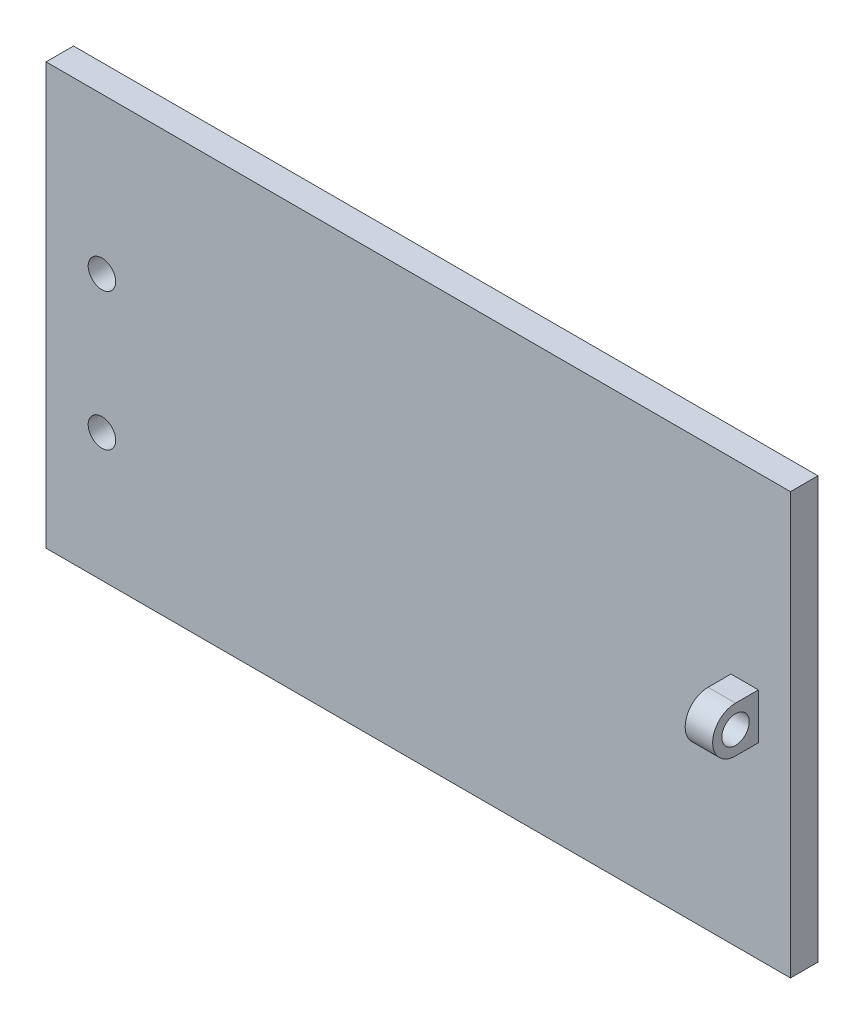
ISO-10303-21;
HEADER;
FILE_DESCRIPTION(('STEP AP214'),'2;1');
FILE_NAME('part.step','',(''),(''),'','','');
FILE_SCHEMA(('AUTOMOTIVE_DESIGN { 1 0 10303 214 1 1 1 1 }'));
ENDSEC;
DATA;
#1=APPLICATION_CONTEXT('core data for automotive mechanical design processes');
#2=APPLICATION_PROTOCOL_DEFINITION('international standard','automotive_design',2000,#1);
#3=PRODUCT_CONTEXT('',#1,'mechanical');
#4=PRODUCT('Part','Part','',(#3));
#5=PRODUCT_RELATED_PRODUCT_CATEGORY('part','',(#4));
#6=PRODUCT_DEFINITION_FORMATION('','',#4);
#7=PRODUCT_DEFINITION_CONTEXT('part definition',#1,'design');
#8=PRODUCT_DEFINITION('design','',#6,#7);
#9=PRODUCT_DEFINITION_SHAPE('','',#8);
#10=(LENGTH_UNIT() NAMED_UNIT(*) SI_UNIT(.MILLI.,.METRE.));
#11=(NAMED_UNIT(*) PLANE_ANGLE_UNIT() SI_UNIT($,.RADIAN.));
#12=(NAMED_UNIT(*) SI_UNIT($,.STERADIAN.) SOLID_ANGLE_UNIT());
#13=UNCERTAINTY_MEASURE_WITH_UNIT(LENGTH_MEASURE(1.E-05),#10,'distance_accuracy_value','');
#14=(GEOMETRIC_REPRESENTATION_CONTEXT(3) GLOBAL_UNCERTAINTY_ASSIGNED_CONTEXT((#13)) GLOBAL_UNIT_ASSIGNED_CONTEXT((#10,
#11,#12)) REPRESENTATION_CONTEXT('',''));
#15=CARTESIAN_POINT('',(0.,0.,0.));
#16=DIRECTION('',(0.,0.,1.));
#17=DIRECTION('',(1.,0.,0.));
#18=AXIS2_PLACEMENT_3D('',#15,#16,#17);
#19=CARTESIAN_POINT('',(34.15,0.,2.5));
#20=DIRECTION('',(-1.,0.,0.));
#21=DIRECTION('',(0.,0.,1.));
#22=AXIS2_PLACEMENT_3D('',#19,#20,#21);
#23=CYLINDRICAL_SURFACE('',#22,2.5);
#24=DIRECTION('',(1.,0.,0.));
#25=VECTOR('',#24,1.);
#26=CARTESIAN_POINT('',(34.15,2.5,2.5));
#27=LINE('',#26,#25);
#28=CARTESIAN_POINT('',(34.15,2.5,2.5));
#29=VERTEX_POINT('',#28);
#30=CARTESIAN_POINT('',(37.15,2.5,2.5));
#31=VERTEX_POINT('',#30);
#32=EDGE_CURVE('E114',#29,#31,#27,.T.);
#33=ORIENTED_EDGE('',*,*,#32,.F.);
#34=CARTESIAN_POINT('',(34.15,0.,2.5));
#35=DIRECTION('',(1.,0.,0.));
#36=DIRECTION('',(0.,0.,-1.));
#37=AXIS2_PLACEMENT_3D('',#34,#35,#36);
#38=CIRCLE('',#37,2.5);
#39=CARTESIAN_POINT('',(34.15,-2.5,2.5));
#40=VERTEX_POINT('',#39);
#41=EDGE_CURVE('E52',#40,#29,#38,.F.);
#42=ORIENTED_EDGE('',*,*,#41,.F.);
#43=DIRECTION('',(1.,0.,0.));
#44=VECTOR('',#43,1.);
#45=CARTESIAN_POINT('',(34.15,-2.5,2.5));
#46=LINE('',#45,#44);
#47=CARTESIAN_POINT('',(37.15,-2.5,2.5));
#48=VERTEX_POINT('',#47);
#49=EDGE_CURVE('E176',#48,#40,#46,.F.);
#50=ORIENTED_EDGE('',*,*,#49,.F.);
#51=CARTESIAN_POINT('',(37.15,0.,2.5));
#52=DIRECTION('',(-1.,0.,0.));
#53=DIRECTION('',(0.,0.,1.));
#54=AXIS2_PLACEMENT_3D('',#51,#52,#53);
#55=CIRCLE('',#54,2.5);
#56=EDGE_CURVE('E11',#31,#48,#55,.F.);
#57=ORIENTED_EDGE('',*,*,#56,.F.);
#58=EDGE_LOOP('',(#33,#42,#50,#57));
#59=FACE_BOUND('',#58,.T.);
#60=ADVANCED_FACE('F43',(#59),#23,.T.);
#61=CARTESIAN_POINT('',(0.,0.,0.));
#62=DIRECTION('',(0.,0.,1.));
#63=DIRECTION('',(1.,0.,0.));
#64=AXIS2_PLACEMENT_3D('',#61,#62,#63);
#65=PLANE('',#64);
#66=CARTESIAN_POINT('',(-34.55,6.,0.));
#67=DIRECTION('',(0.,0.,1.));
#68=DIRECTION('',(1.,0.,0.));
#69=AXIS2_PLACEMENT_3D('',#66,#67,#68);
#70=CIRCLE('',#69,1.5);
#71=CARTESIAN_POINT('',(-33.05,6.,0.));
#72=VERTEX_POINT('',#71);
#73=EDGE_CURVE('E180',#72,#72,#70,.T.);
#74=ORIENTED_EDGE('',*,*,#73,.F.);
#75=EDGE_LOOP('',(#74));
#76=FACE_BOUND('',#75,.T.);
#77=CARTESIAN_POINT('',(-34.55,-9.,0.));
#78=DIRECTION('',(0.,0.,1.));
#79=DIRECTION('',(1.,0.,0.));
#80=AXIS2_PLACEMENT_3D('',#77,#78,#79);
#81=CIRCLE('',#80,1.5);
#82=CARTESIAN_POINT('',(-33.05,-9.,0.));
#83=VERTEX_POINT('',#82);
#84=EDGE_CURVE('E185',#83,#83,#81,.T.);
#85=ORIENTED_EDGE('',*,*,#84,.F.);
#86=EDGE_LOOP('',(#85));
#87=FACE_BOUND('',#86,.T.);
#88=DIRECTION('',(0.,1.,0.));
#89=VECTOR('',#88,1.);
#90=CARTESIAN_POINT('',(40.65,23.,0.));
#91=LINE('',#90,#89);
#92=CARTESIAN_POINT('',(40.65,-23.,0.));
#93=VERTEX_POINT('',#92);
#94=CARTESIAN_POINT('',(40.65,23.,0.));
#95=VERTEX_POINT('',#94);
#96=EDGE_CURVE('E115',#93,#95,#91,.T.);
#97=ORIENTED_EDGE('',*,*,#96,.T.);
#98=DIRECTION('',(-1.,0.,0.));
#99=VECTOR('',#98,1.);
#100=CARTESIAN_POINT('',(-40.65,23.,0.));
#101=LINE('',#100,#99);
#102=CARTESIAN_POINT('',(-40.65,23.,0.));
#103=VERTEX_POINT('',#102);
#104=EDGE_CURVE('E157',#95,#103,#101,.T.);
#105=ORIENTED_EDGE('',*,*,#104,.T.);
#106=DIRECTION('',(0.,-1.,0.));
#107=VECTOR('',#106,1.);
#108=CARTESIAN_POINT('',(-40.65,23.,0.));
#109=LINE('',#108,#107);
#110=CARTESIAN_POINT('',(-40.65,-23.,0.));
#111=VERTEX_POINT('',#110);
#112=EDGE_CURVE('E160',#103,#111,#109,.T.);
#113=ORIENTED_EDGE('',*,*,#112,.T.);
#114=DIRECTION('',(1.,0.,0.));
#115=VECTOR('',#114,1.);
#116=CARTESIAN_POINT('',(-40.65,-23.,0.));
#117=LINE('',#116,#115);
#118=EDGE_CURVE('E145',#111,#93,#117,.T.);
#119=ORIENTED_EDGE('',*,*,#118,.T.);
#120=EDGE_LOOP('',(#97,#105,#113,#119));
#121=FACE_BOUND('',#120,.T.);
#122=DIRECTION('',(-1.,0.,0.));
#123=VECTOR('',#122,1.);
#124=CARTESIAN_POINT('',(34.15,2.5,0.));
#125=LINE('',#124,#123);
#126=CARTESIAN_POINT('',(37.15,2.5,0.));
#127=VERTEX_POINT('',#126);
#128=CARTESIAN_POINT('',(34.15,2.5,0.));
#129=VERTEX_POINT('',#128);
#130=EDGE_CURVE('E112',#127,#129,#125,.T.);
#131=ORIENTED_EDGE('',*,*,#130,.F.);
#132=DIRECTION('',(0.,1.,0.));
#133=VECTOR('',#132,1.);
#134=CARTESIAN_POINT('',(37.15,2.5,0.));
#135=LINE('',#134,#133);
#136=CARTESIAN_POINT('',(37.15,-2.5,0.));
#137=VERTEX_POINT('',#136);
#138=EDGE_CURVE('E119',#137,#127,#135,.T.);
#139=ORIENTED_EDGE('',*,*,#138,.F.);
#140=DIRECTION('',(1.,0.,0.));
#141=VECTOR('',#140,1.);
#142=CARTESIAN_POINT('',(34.15,-2.5,0.));
#143=LINE('',#142,#141);
#144=CARTESIAN_POINT('',(34.15,-2.5,0.));
#145=VERTEX_POINT('',#144);
#146=EDGE_CURVE('E132',#145,#137,#143,.T.);
#147=ORIENTED_EDGE('',*,*,#146,.F.);
#148=DIRECTION('',(0.,-1.,0.));
#149=VECTOR('',#148,1.);
#150=CARTESIAN_POINT('',(34.15,2.5,0.));
#151=LINE('',#150,#149);
#152=EDGE_CURVE('E130',#129,#145,#151,.T.);
#153=ORIENTED_EDGE('',*,*,#152,.F.);
#154=EDGE_LOOP('',(#131,#139,#147,#153));
#155=FACE_BOUND('',#154,.T.);
#156=ADVANCED_FACE('F128',(#76,#87,#121,#155),#65,.T.);
#157=CARTESIAN_POINT('',(40.65,23.,-3.));
#158=DIRECTION('',(1.,0.,0.));
#159=DIRECTION('',(0.,0.,-1.));
#160=AXIS2_PLACEMENT_3D('',#157,#158,#159);
#161=PLANE('',#160);
#162=ORIENTED_EDGE('',*,*,#96,.F.);
#163=DIRECTION('',(0.,0.,1.));
#164=VECTOR('',#163,1.);
#165=CARTESIAN_POINT('',(40.65,-23.,-3.));
#166=LINE('',#165,#164);
#167=CARTESIAN_POINT('',(40.65,-23.,-3.));
#168=VERTEX_POINT('',#167);
#169=EDGE_CURVE('E165',#168,#93,#166,.T.);
#170=ORIENTED_EDGE('',*,*,#169,.F.);
#171=DIRECTION('',(0.,1.,0.));
#172=VECTOR('',#171,1.);
#173=CARTESIAN_POINT('',(40.65,23.,-3.));
#174=LINE('',#173,#172);
#175=CARTESIAN_POINT('',(40.65,23.,-3.));
#176=VERTEX_POINT('',#175);
#177=EDGE_CURVE('E141',#168,#176,#174,.T.);
#178=ORIENTED_EDGE('',*,*,#177,.T.);
#179=DIRECTION('',(0.,0.,1.));
#180=VECTOR('',#179,1.);
#181=CARTESIAN_POINT('',(40.65,23.,-3.));
#182=LINE('',#181,#180);
#183=EDGE_CURVE('E154',#176,#95,#182,.T.);
#184=ORIENTED_EDGE('',*,*,#183,.T.);
#185=EDGE_LOOP('',(#162,#170,#178,#184));
#186=FACE_BOUND('',#185,.T.);
#187=ADVANCED_FACE('F213',(#186),#161,.T.);
#188=CARTESIAN_POINT('',(-40.65,-23.,-3.));
#189=DIRECTION('',(0.,-1.,0.));
#190=DIRECTION('',(0.,0.,-1.));
#191=AXIS2_PLACEMENT_3D('',#188,#189,#190);
#192=PLANE('',#191);
#193=ORIENTED_EDGE('',*,*,#118,.F.);
#194=DIRECTION('',(0.,0.,1.));
#195=VECTOR('',#194,1.);
#196=CARTESIAN_POINT('',(-40.65,-23.,-3.));
#197=LINE('',#196,#195);
#198=CARTESIAN_POINT('',(-40.65,-23.,-3.));
#199=VERTEX_POINT('',#198);
#200=EDGE_CURVE('E167',#199,#111,#197,.T.);
#201=ORIENTED_EDGE('',*,*,#200,.F.);
#202=DIRECTION('',(1.,0.,0.));
#203=VECTOR('',#202,1.);
#204=CARTESIAN_POINT('',(-40.65,-23.,-3.));
#205=LINE('',#204,#203);
#206=EDGE_CURVE('E151',#199,#168,#205,.T.);
#207=ORIENTED_EDGE('',*,*,#206,.T.);
#208=ORIENTED_EDGE('',*,*,#169,.T.);
#209=EDGE_LOOP('',(#193,#201,#207,#208));
#210=FACE_BOUND('',#209,.T.);
#211=ADVANCED_FACE('F248',(#210),#192,.T.);
#212=CARTESIAN_POINT('',(-40.65,23.,-3.));
#213=DIRECTION('',(-1.,0.,0.));
#214=DIRECTION('',(0.,-1.,0.));
#215=AXIS2_PLACEMENT_3D('',#212,#213,#214);
#216=PLANE('',#215);
#217=ORIENTED_EDGE('',*,*,#112,.F.);
#218=DIRECTION('',(0.,0.,1.));
#219=VECTOR('',#218,1.);
#220=CARTESIAN_POINT('',(-40.65,23.,-3.));
#221=LINE('',#220,#219);
#222=CARTESIAN_POINT('',(-40.65,23.,-3.));
#223=VERTEX_POINT('',#222);
#224=EDGE_CURVE('E169',#223,#103,#221,.T.);
#225=ORIENTED_EDGE('',*,*,#224,.F.);
#226=DIRECTION('',(0.,-1.,0.));
#227=VECTOR('',#226,1.);
#228=CARTESIAN_POINT('',(-40.65,23.,-3.));
#229=LINE('',#228,#227);
#230=EDGE_CURVE('E148',#223,#199,#229,.T.);
#231=ORIENTED_EDGE('',*,*,#230,.T.);
#232=ORIENTED_EDGE('',*,*,#200,.T.);
#233=EDGE_LOOP('',(#217,#225,#231,#232));
#234=FACE_BOUND('',#233,.T.);
#235=ADVANCED_FACE('F252',(#234),#216,.T.);
#236=CARTESIAN_POINT('',(-40.65,23.,-3.));
#237=DIRECTION('',(0.,1.,0.));
#238=DIRECTION('',(0.,0.,1.));
#239=AXIS2_PLACEMENT_3D('',#236,#237,#238);
#240=PLANE('',#239);
#241=ORIENTED_EDGE('',*,*,#104,.F.);
#242=ORIENTED_EDGE('',*,*,#183,.F.);
#243=DIRECTION('',(-1.,0.,0.));
#244=VECTOR('',#243,1.);
#245=CARTESIAN_POINT('',(-40.65,23.,-3.));
#246=LINE('',#245,#244);
#247=EDGE_CURVE('E144',#176,#223,#246,.T.);
#248=ORIENTED_EDGE('',*,*,#247,.T.);
#249=ORIENTED_EDGE('',*,*,#224,.T.);
#250=EDGE_LOOP('',(#241,#242,#248,#249));
#251=FACE_BOUND('',#250,.T.);
#252=ADVANCED_FACE('F206',(#251),#240,.T.);
#253=CARTESIAN_POINT('',(0.,0.,-3.));
#254=DIRECTION('',(0.,0.,1.));
#255=DIRECTION('',(1.,0.,0.));
#256=AXIS2_PLACEMENT_3D('',#253,#254,#255);
#257=PLANE('',#256);
#258=CARTESIAN_POINT('',(-34.55,6.,-3.));
#259=DIRECTION('',(0.,0.,1.));
#260=DIRECTION('',(1.,0.,0.));
#261=AXIS2_PLACEMENT_3D('',#258,#259,#260);
#262=CIRCLE('',#261,1.5);
#263=CARTESIAN_POINT('',(-33.05,6.,-3.));
#264=VERTEX_POINT('',#263);
#265=EDGE_CURVE('E47',#264,#264,#262,.T.);
#266=ORIENTED_EDGE('',*,*,#265,.T.);
#267=EDGE_LOOP('',(#266));
#268=FACE_BOUND('',#267,.T.);
#269=CARTESIAN_POINT('',(-34.55,-9.,-3.));
#270=DIRECTION('',(0.,0.,1.));
#271=DIRECTION('',(1.,0.,0.));
#272=AXIS2_PLACEMENT_3D('',#269,#270,#271);
#273=CIRCLE('',#272,1.5);
#274=CARTESIAN_POINT('',(-33.05,-9.,-3.));
#275=VERTEX_POINT('',#274);
#276=EDGE_CURVE('E178',#275,#275,#273,.T.);
#277=ORIENTED_EDGE('',*,*,#276,.T.);
#278=EDGE_LOOP('',(#277));
#279=FACE_BOUND('',#278,.T.);
#280=ORIENTED_EDGE('',*,*,#177,.F.);
#281=ORIENTED_EDGE('',*,*,#206,.F.);
#282=ORIENTED_EDGE('',*,*,#230,.F.);
#283=ORIENTED_EDGE('',*,*,#247,.F.);
#284=EDGE_LOOP('',(#280,#281,#282,#283));
#285=FACE_BOUND('',#284,.T.);
#286=ADVANCED_FACE('F197',(#268,#279,#285),#257,.F.);
#287=CARTESIAN_POINT('',(37.15,2.5,5.));
#288=DIRECTION('',(-1.,0.,0.));
#289=DIRECTION('',(0.,0.,1.));
#290=AXIS2_PLACEMENT_3D('',#287,#288,#289);
#291=PLANE('',#290);
#292=CARTESIAN_POINT('',(37.15,0.,2.49999999999999));
#293=DIRECTION('',(-1.,0.,0.));
#294=DIRECTION('',(0.,0.,1.));
#295=AXIS2_PLACEMENT_3D('',#292,#293,#294);
#296=CIRCLE('',#295,1.5);
#297=CARTESIAN_POINT('',(37.15,0.,3.99999999999999));
#298=VERTEX_POINT('',#297);
#299=EDGE_CURVE('E126',#298,#298,#296,.F.);
#300=ORIENTED_EDGE('',*,*,#299,.F.);
#301=EDGE_LOOP('',(#300));
#302=FACE_BOUND('',#301,.T.);
#303=DIRECTION('',(0.,0.,-1.));
#304=VECTOR('',#303,1.);
#305=CARTESIAN_POINT('',(37.15,2.5,5.));
#306=LINE('',#305,#304);
#307=EDGE_CURVE('E107',#31,#127,#306,.T.);
#308=ORIENTED_EDGE('',*,*,#307,.F.);
#309=ORIENTED_EDGE('',*,*,#56,.T.);
#310=DIRECTION('',(0.,0.,-1.));
#311=VECTOR('',#310,1.);
#312=CARTESIAN_POINT('',(37.15,-2.5,5.));
#313=LINE('',#312,#311);
#314=EDGE_CURVE('E122',#48,#137,#313,.T.);
#315=ORIENTED_EDGE('',*,*,#314,.T.);
#316=ORIENTED_EDGE('',*,*,#138,.T.);
#317=EDGE_LOOP('',(#308,#309,#315,#316));
#318=FACE_BOUND('',#317,.T.);
#319=ADVANCED_FACE('F120',(#302,#318),#291,.F.);
#320=CARTESIAN_POINT('',(34.15,2.5,5.));
#321=DIRECTION('',(0.,-1.,0.));
#322=DIRECTION('',(0.,0.,-1.));
#323=AXIS2_PLACEMENT_3D('',#320,#321,#322);
#324=PLANE('',#323);
#325=DIRECTION('',(0.,0.,-1.));
#326=VECTOR('',#325,1.);
#327=CARTESIAN_POINT('',(34.15,2.5,5.));
#328=LINE('',#327,#326);
#329=EDGE_CURVE('E116',#29,#129,#328,.T.);
#330=ORIENTED_EDGE('',*,*,#329,.F.);
#331=ORIENTED_EDGE('',*,*,#32,.T.);
#332=ORIENTED_EDGE('',*,*,#307,.T.);
#333=ORIENTED_EDGE('',*,*,#130,.T.);
#334=EDGE_LOOP('',(#330,#331,#332,#333));
#335=FACE_BOUND('',#334,.T.);
#336=ADVANCED_FACE('F110',(#335),#324,.F.);
#337=CARTESIAN_POINT('',(34.15,2.5,5.));
#338=DIRECTION('',(1.,0.,0.));
#339=DIRECTION('',(0.,0.,-1.));
#340=AXIS2_PLACEMENT_3D('',#337,#338,#339);
#341=PLANE('',#340);
#342=CARTESIAN_POINT('',(34.15,0.,2.49999999999999));
#343=DIRECTION('',(1.,0.,0.));
#344=DIRECTION('',(0.,0.,-1.));
#345=AXIS2_PLACEMENT_3D('',#342,#343,#344);
#346=CIRCLE('',#345,1.5);
#347=CARTESIAN_POINT('',(34.15,0.,0.999999999999991));
#348=VERTEX_POINT('',#347);
#349=EDGE_CURVE('E172',#348,#348,#346,.F.);
#350=ORIENTED_EDGE('',*,*,#349,.F.);
#351=EDGE_LOOP('',(#350));
#352=FACE_BOUND('',#351,.T.);
#353=DIRECTION('',(0.,0.,-1.));
#354=VECTOR('',#353,1.);
#355=CARTESIAN_POINT('',(34.15,-2.5,5.));
#356=LINE('',#355,#354);
#357=EDGE_CURVE('E138',#40,#145,#356,.T.);
#358=ORIENTED_EDGE('',*,*,#357,.F.);
#359=ORIENTED_EDGE('',*,*,#41,.T.);
#360=ORIENTED_EDGE('',*,*,#329,.T.);
#361=ORIENTED_EDGE('',*,*,#152,.T.);
#362=EDGE_LOOP('',(#358,#359,#360,#361));
#363=FACE_BOUND('',#362,.T.);
#364=ADVANCED_FACE('F203',(#352,#363),#341,.F.);
#365=CARTESIAN_POINT('',(34.15,-2.5,5.));
#366=DIRECTION('',(0.,1.,0.));
#367=DIRECTION('',(0.,0.,1.));
#368=AXIS2_PLACEMENT_3D('',#365,#366,#367);
#369=PLANE('',#368);
#370=ORIENTED_EDGE('',*,*,#314,.F.);
#371=ORIENTED_EDGE('',*,*,#49,.T.);
#372=ORIENTED_EDGE('',*,*,#357,.T.);
#373=ORIENTED_EDGE('',*,*,#146,.T.);
#374=EDGE_LOOP('',(#370,#371,#372,#373));
#375=FACE_BOUND('',#374,.T.);
#376=ADVANCED_FACE('F219',(#375),#369,.F.);
#377=CARTESIAN_POINT('',(40.65,0.,2.49999999999999));
#378=DIRECTION('',(-1.,0.,0.));
#379=DIRECTION('',(0.,0.,1.));
#380=AXIS2_PLACEMENT_3D('',#377,#378,#379);
#381=CYLINDRICAL_SURFACE('',#380,1.5);
#382=ORIENTED_EDGE('',*,*,#349,.T.);
#383=EDGE_LOOP('',(#382));
#384=FACE_BOUND('',#383,.T.);
#385=ORIENTED_EDGE('',*,*,#299,.T.);
#386=EDGE_LOOP('',(#385));
#387=FACE_BOUND('',#386,.T.);
#388=ADVANCED_FACE('F194',(#384,#387),#381,.F.);
#389=CARTESIAN_POINT('',(-34.55,-9.,-10.));
#390=DIRECTION('',(0.,0.,1.));
#391=DIRECTION('',(1.,0.,0.));
#392=AXIS2_PLACEMENT_3D('',#389,#390,#391);
#393=CYLINDRICAL_SURFACE('',#392,1.5);
#394=ORIENTED_EDGE('',*,*,#84,.T.);
#395=EDGE_LOOP('',(#394));
#396=FACE_BOUND('',#395,.T.);
#397=ORIENTED_EDGE('',*,*,#276,.F.);
#398=EDGE_LOOP('',(#397));
#399=FACE_BOUND('',#398,.T.);
#400=ADVANCED_FACE('F225',(#396,#399),#393,.F.);
#401=CARTESIAN_POINT('',(-34.55,6.,-10.));
#402=DIRECTION('',(0.,0.,1.));
#403=DIRECTION('',(1.,0.,0.));
#404=AXIS2_PLACEMENT_3D('',#401,#402,#403);
#405=CYLINDRICAL_SURFACE('',#404,1.5);
#406=ORIENTED_EDGE('',*,*,#73,.T.);
#407=EDGE_LOOP('',(#406));
#408=FACE_BOUND('',#407,.T.);
#409=ORIENTED_EDGE('',*,*,#265,.F.);
#410=EDGE_LOOP('',(#409));
#411=FACE_BOUND('',#410,.T.);
#412=ADVANCED_FACE('F233',(#408,#411),#405,.F.);
#413=CLOSED_SHELL('',(#60,#156,#187,#211,#235,#252,#286,#319,#336,#364,#376,#388,#400,#412));
#414=MANIFOLD_SOLID_BREP('B2',#413);
#415=ADVANCED_BREP_SHAPE_REPRESENTATION('',(#18,#414),#14);
#416=SHAPE_DEFINITION_REPRESENTATION(#9,#415);
ENDSEC;
END-ISO-10303-21;
